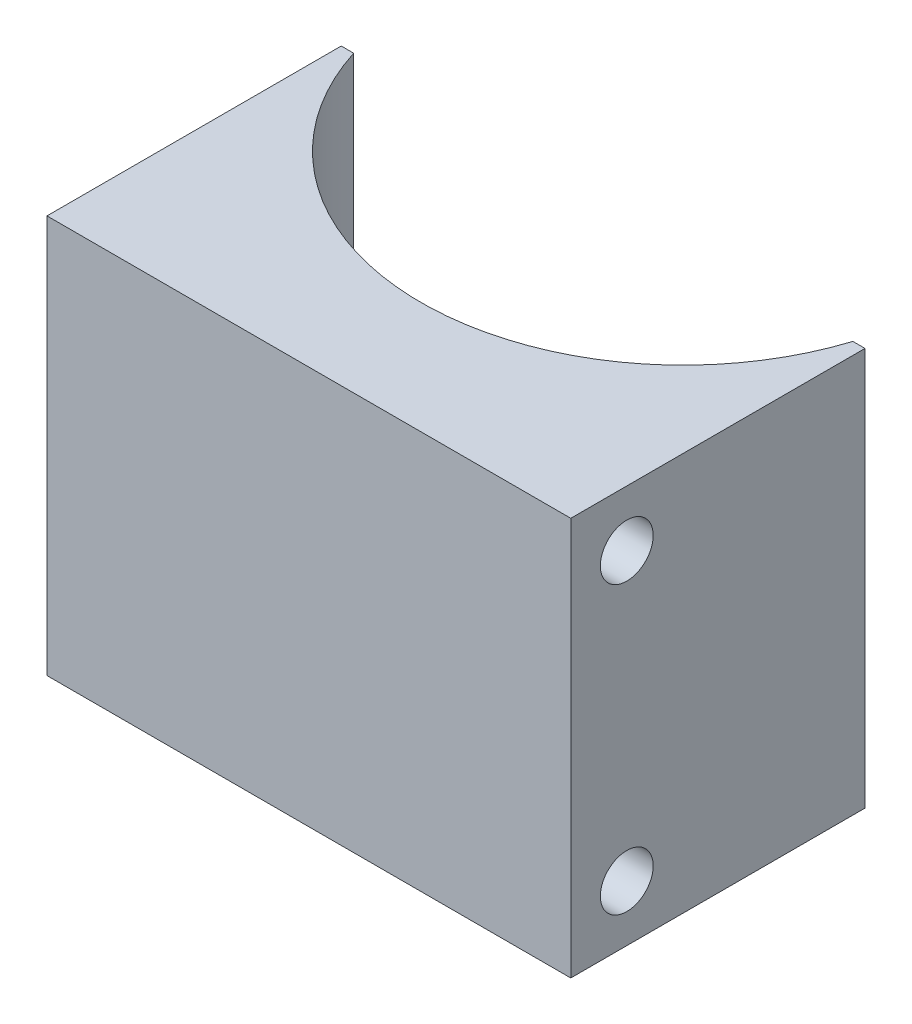
ISO-10303-21;
HEADER;
FILE_DESCRIPTION(('STEP AP214'),'2;1');
FILE_NAME('part.step','',(''),(''),'','','');
FILE_SCHEMA(('AUTOMOTIVE_DESIGN { 1 0 10303 214 1 1 1 1 }'));
ENDSEC;
DATA;
#1=APPLICATION_CONTEXT('core data for automotive mechanical design processes');
#2=APPLICATION_PROTOCOL_DEFINITION('international standard','automotive_design',2000,#1);
#3=PRODUCT_CONTEXT('',#1,'mechanical');
#4=PRODUCT('Part','Part','',(#3));
#5=PRODUCT_RELATED_PRODUCT_CATEGORY('part','',(#4));
#6=PRODUCT_DEFINITION_FORMATION('','',#4);
#7=PRODUCT_DEFINITION_CONTEXT('part definition',#1,'design');
#8=PRODUCT_DEFINITION('design','',#6,#7);
#9=PRODUCT_DEFINITION_SHAPE('','',#8);
#10=(LENGTH_UNIT() NAMED_UNIT(*) SI_UNIT(.MILLI.,.METRE.));
#11=(NAMED_UNIT(*) PLANE_ANGLE_UNIT() SI_UNIT($,.RADIAN.));
#12=(NAMED_UNIT(*) SI_UNIT($,.STERADIAN.) SOLID_ANGLE_UNIT());
#13=UNCERTAINTY_MEASURE_WITH_UNIT(LENGTH_MEASURE(1.E-05),#10,'distance_accuracy_value','');
#14=(GEOMETRIC_REPRESENTATION_CONTEXT(3) GLOBAL_UNCERTAINTY_ASSIGNED_CONTEXT((#13)) GLOBAL_UNIT_ASSIGNED_CONTEXT((#10,
#11,#12)) REPRESENTATION_CONTEXT('',''));
#15=CARTESIAN_POINT('',(0.,0.,0.));
#16=DIRECTION('',(0.,0.,1.));
#17=DIRECTION('',(1.,0.,0.));
#18=AXIS2_PLACEMENT_3D('',#15,#16,#17);
#19=CARTESIAN_POINT('',(44.075,16.,0.));
#20=DIRECTION('',(1.,0.,0.));
#21=DIRECTION('',(0.,0.,-1.));
#22=AXIS2_PLACEMENT_3D('',#19,#20,#21);
#23=PLANE('',#22);
#24=DIRECTION('',(0.,-1.,0.));
#25=VECTOR('',#24,1.);
#26=CARTESIAN_POINT('',(44.075,16.,6.41287766919032));
#27=LINE('',#26,#25);
#28=CARTESIAN_POINT('',(44.075,16.,6.41287766919032));
#29=VERTEX_POINT('',#28);
#30=CARTESIAN_POINT('',(44.075,-16.,6.41287766919032));
#31=VERTEX_POINT('',#30);
#32=EDGE_CURVE('E54',#29,#31,#27,.T.);
#33=ORIENTED_EDGE('',*,*,#32,.T.);
#34=DIRECTION('',(0.,0.,1.));
#35=VECTOR('',#34,1.);
#36=CARTESIAN_POINT('',(44.075,-16.,0.));
#37=LINE('',#36,#35);
#38=CARTESIAN_POINT('',(44.075,-16.,30.0625));
#39=VERTEX_POINT('',#38);
#40=EDGE_CURVE('E117',#31,#39,#37,.T.);
#41=ORIENTED_EDGE('',*,*,#40,.T.);
#42=DIRECTION('',(0.,-1.,0.));
#43=VECTOR('',#42,1.);
#44=CARTESIAN_POINT('',(44.075,16.,30.0625));
#45=LINE('',#44,#43);
#46=CARTESIAN_POINT('',(44.075,16.,30.0625));
#47=VERTEX_POINT('',#46);
#48=EDGE_CURVE('E150',#47,#39,#45,.T.);
#49=ORIENTED_EDGE('',*,*,#48,.F.);
#50=DIRECTION('',(0.,0.,1.));
#51=VECTOR('',#50,1.);
#52=CARTESIAN_POINT('',(44.075,16.,0.));
#53=LINE('',#52,#51);
#54=EDGE_CURVE('E138',#29,#47,#53,.T.);
#55=ORIENTED_EDGE('',*,*,#54,.F.);
#56=EDGE_LOOP('',(#33,#41,#49,#55));
#57=FACE_BOUND('',#56,.T.);
#58=CARTESIAN_POINT('',(44.075,-11.5,25.5625));
#59=DIRECTION('',(-1.,0.,0.));
#60=DIRECTION('',(0.,0.,1.));
#61=AXIS2_PLACEMENT_3D('',#58,#59,#60);
#62=CIRCLE('',#61,2.125);
#63=CARTESIAN_POINT('',(44.075,-11.5,27.6875));
#64=VERTEX_POINT('',#63);
#65=EDGE_CURVE('E123',#64,#64,#62,.F.);
#66=ORIENTED_EDGE('',*,*,#65,.T.);
#67=EDGE_LOOP('',(#66));
#68=FACE_BOUND('',#67,.T.);
#69=CARTESIAN_POINT('',(44.075,11.5,25.5625));
#70=DIRECTION('',(-1.,0.,0.));
#71=DIRECTION('',(0.,0.,1.));
#72=AXIS2_PLACEMENT_3D('',#69,#70,#71);
#73=CIRCLE('',#72,2.125);
#74=CARTESIAN_POINT('',(44.075,11.5,27.6875));
#75=VERTEX_POINT('',#74);
#76=EDGE_CURVE('E153',#75,#75,#73,.T.);
#77=ORIENTED_EDGE('',*,*,#76,.F.);
#78=EDGE_LOOP('',(#77));
#79=FACE_BOUND('',#78,.T.);
#80=ADVANCED_FACE('F45',(#57,#68,#79),#23,.F.);
#81=CARTESIAN_POINT('',(86.175,16.,0.));
#82=DIRECTION('',(1.,0.,0.));
#83=DIRECTION('',(0.,0.,-1.));
#84=AXIS2_PLACEMENT_3D('',#81,#82,#83);
#85=PLANE('',#84);
#86=CARTESIAN_POINT('',(86.175,-11.5,25.5625));
#87=DIRECTION('',(1.,0.,0.));
#88=DIRECTION('',(0.,0.,-1.));
#89=AXIS2_PLACEMENT_3D('',#86,#87,#88);
#90=CIRCLE('',#89,2.125);
#91=CARTESIAN_POINT('',(86.175,-11.5,23.4375));
#92=VERTEX_POINT('',#91);
#93=EDGE_CURVE('E121',#92,#92,#90,.F.);
#94=ORIENTED_EDGE('',*,*,#93,.T.);
#95=EDGE_LOOP('',(#94));
#96=FACE_BOUND('',#95,.T.);
#97=DIRECTION('',(0.,-1.,0.));
#98=VECTOR('',#97,1.);
#99=CARTESIAN_POINT('',(86.175,16.,30.0625));
#100=LINE('',#99,#98);
#101=CARTESIAN_POINT('',(86.175,16.,30.0625));
#102=VERTEX_POINT('',#101);
#103=CARTESIAN_POINT('',(86.175,-16.,30.0625));
#104=VERTEX_POINT('',#103);
#105=EDGE_CURVE('E148',#102,#104,#100,.T.);
#106=ORIENTED_EDGE('',*,*,#105,.T.);
#107=DIRECTION('',(0.,0.,1.));
#108=VECTOR('',#107,1.);
#109=CARTESIAN_POINT('',(86.175,-16.,0.));
#110=LINE('',#109,#108);
#111=CARTESIAN_POINT('',(86.175,-16.,6.41287766919032));
#112=VERTEX_POINT('',#111);
#113=EDGE_CURVE('E130',#112,#104,#110,.T.);
#114=ORIENTED_EDGE('',*,*,#113,.F.);
#115=DIRECTION('',(0.,-1.,0.));
#116=VECTOR('',#115,1.);
#117=CARTESIAN_POINT('',(86.175,16.,6.41287766919032));
#118=LINE('',#117,#116);
#119=CARTESIAN_POINT('',(86.175,16.,6.41287766919032));
#120=VERTEX_POINT('',#119);
#121=EDGE_CURVE('E70',#120,#112,#118,.T.);
#122=ORIENTED_EDGE('',*,*,#121,.F.);
#123=DIRECTION('',(0.,0.,1.));
#124=VECTOR('',#123,1.);
#125=CARTESIAN_POINT('',(86.175,16.,0.));
#126=LINE('',#125,#124);
#127=EDGE_CURVE('E142',#120,#102,#126,.T.);
#128=ORIENTED_EDGE('',*,*,#127,.T.);
#129=EDGE_LOOP('',(#106,#114,#122,#128));
#130=FACE_BOUND('',#129,.T.);
#131=CARTESIAN_POINT('',(86.175,11.5,25.5625));
#132=DIRECTION('',(1.,0.,0.));
#133=DIRECTION('',(0.,0.,-1.));
#134=AXIS2_PLACEMENT_3D('',#131,#132,#133);
#135=CIRCLE('',#134,2.125);
#136=CARTESIAN_POINT('',(86.175,11.5,23.4375));
#137=VERTEX_POINT('',#136);
#138=EDGE_CURVE('E49',#137,#137,#135,.T.);
#139=ORIENTED_EDGE('',*,*,#138,.F.);
#140=EDGE_LOOP('',(#139));
#141=FACE_BOUND('',#140,.T.);
#142=ADVANCED_FACE('F179',(#96,#130,#141),#85,.T.);
#143=CARTESIAN_POINT('',(65.1375,16.,0.));
#144=DIRECTION('',(0.,-1.,0.));
#145=DIRECTION('',(0.,0.,-1.));
#146=AXIS2_PLACEMENT_3D('',#143,#144,#145);
#147=CYLINDRICAL_SURFACE('',#146,21.0625);
#148=DIRECTION('',(0.,-1.,0.));
#149=VECTOR('',#148,1.);
#150=CARTESIAN_POINT('',(85.2,16.,6.41287766919032));
#151=LINE('',#150,#149);
#152=CARTESIAN_POINT('',(85.2,16.,6.41287766919032));
#153=VERTEX_POINT('',#152);
#154=CARTESIAN_POINT('',(85.2,-16.,6.41287766919032));
#155=VERTEX_POINT('',#154);
#156=EDGE_CURVE('E62',#153,#155,#151,.T.);
#157=ORIENTED_EDGE('',*,*,#156,.T.);
#158=CARTESIAN_POINT('',(65.1375,-16.,0.));
#159=DIRECTION('',(0.,1.,0.));
#160=DIRECTION('',(0.,0.,1.));
#161=AXIS2_PLACEMENT_3D('',#158,#159,#160);
#162=CIRCLE('',#161,21.0625);
#163=CARTESIAN_POINT('',(45.075,-16.,6.41287766919032));
#164=VERTEX_POINT('',#163);
#165=EDGE_CURVE('E114',#164,#155,#162,.T.);
#166=ORIENTED_EDGE('',*,*,#165,.F.);
#167=DIRECTION('',(0.,-1.,0.));
#168=VECTOR('',#167,1.);
#169=CARTESIAN_POINT('',(45.075,16.,6.41287766919032));
#170=LINE('',#169,#168);
#171=CARTESIAN_POINT('',(45.075,16.,6.41287766919032));
#172=VERTEX_POINT('',#171);
#173=EDGE_CURVE('E11',#172,#164,#170,.T.);
#174=ORIENTED_EDGE('',*,*,#173,.F.);
#175=CARTESIAN_POINT('',(65.1375,16.,0.));
#176=DIRECTION('',(0.,1.,0.));
#177=DIRECTION('',(0.,0.,1.));
#178=AXIS2_PLACEMENT_3D('',#175,#176,#177);
#179=CIRCLE('',#178,21.0625);
#180=EDGE_CURVE('E135',#172,#153,#179,.T.);
#181=ORIENTED_EDGE('',*,*,#180,.T.);
#182=EDGE_LOOP('',(#157,#166,#174,#181));
#183=FACE_BOUND('',#182,.T.);
#184=ADVANCED_FACE('F47',(#183),#147,.F.);
#185=CARTESIAN_POINT('',(0.,16.,6.41287766919032));
#186=DIRECTION('',(0.,0.,-1.));
#187=DIRECTION('',(-1.,0.,0.));
#188=AXIS2_PLACEMENT_3D('',#185,#186,#187);
#189=PLANE('',#188);
#190=ORIENTED_EDGE('',*,*,#173,.T.);
#191=DIRECTION('',(1.,0.,0.));
#192=VECTOR('',#191,1.);
#193=CARTESIAN_POINT('',(0.,-16.,6.41287766919032));
#194=LINE('',#193,#192);
#195=EDGE_CURVE('E103',#31,#164,#194,.T.);
#196=ORIENTED_EDGE('',*,*,#195,.F.);
#197=ORIENTED_EDGE('',*,*,#32,.F.);
#198=DIRECTION('',(1.,0.,0.));
#199=VECTOR('',#198,1.);
#200=CARTESIAN_POINT('',(0.,16.,6.41287766919032));
#201=LINE('',#200,#199);
#202=EDGE_CURVE('E106',#29,#172,#201,.T.);
#203=ORIENTED_EDGE('',*,*,#202,.T.);
#204=EDGE_LOOP('',(#190,#196,#197,#203));
#205=FACE_BOUND('',#204,.T.);
#206=ADVANCED_FACE('F102',(#205),#189,.T.);
#207=CARTESIAN_POINT('',(0.,16.,30.0625));
#208=DIRECTION('',(0.,0.,-1.));
#209=DIRECTION('',(-1.,0.,0.));
#210=AXIS2_PLACEMENT_3D('',#207,#208,#209);
#211=PLANE('',#210);
#212=ORIENTED_EDGE('',*,*,#48,.T.);
#213=DIRECTION('',(1.,0.,0.));
#214=VECTOR('',#213,1.);
#215=CARTESIAN_POINT('',(0.,-16.,30.0625));
#216=LINE('',#215,#214);
#217=EDGE_CURVE('E127',#39,#104,#216,.T.);
#218=ORIENTED_EDGE('',*,*,#217,.T.);
#219=ORIENTED_EDGE('',*,*,#105,.F.);
#220=DIRECTION('',(1.,0.,0.));
#221=VECTOR('',#220,1.);
#222=CARTESIAN_POINT('',(0.,16.,30.0625));
#223=LINE('',#222,#221);
#224=EDGE_CURVE('E140',#47,#102,#223,.T.);
#225=ORIENTED_EDGE('',*,*,#224,.F.);
#226=EDGE_LOOP('',(#212,#218,#219,#225));
#227=FACE_BOUND('',#226,.T.);
#228=ADVANCED_FACE('F186',(#227),#211,.F.);
#229=CARTESIAN_POINT('',(0.,16.,6.41287766919032));
#230=DIRECTION('',(0.,0.,-1.));
#231=DIRECTION('',(-1.,0.,0.));
#232=AXIS2_PLACEMENT_3D('',#229,#230,#231);
#233=PLANE('',#232);
#234=ORIENTED_EDGE('',*,*,#121,.T.);
#235=DIRECTION('',(1.,0.,0.));
#236=VECTOR('',#235,1.);
#237=CARTESIAN_POINT('',(0.,-16.,6.41287766919032));
#238=LINE('',#237,#236);
#239=EDGE_CURVE('E133',#155,#112,#238,.T.);
#240=ORIENTED_EDGE('',*,*,#239,.F.);
#241=ORIENTED_EDGE('',*,*,#156,.F.);
#242=DIRECTION('',(1.,0.,0.));
#243=VECTOR('',#242,1.);
#244=CARTESIAN_POINT('',(0.,16.,6.41287766919032));
#245=LINE('',#244,#243);
#246=EDGE_CURVE('E144',#153,#120,#245,.T.);
#247=ORIENTED_EDGE('',*,*,#246,.T.);
#248=EDGE_LOOP('',(#234,#240,#241,#247));
#249=FACE_BOUND('',#248,.T.);
#250=ADVANCED_FACE('F192',(#249),#233,.T.);
#251=CARTESIAN_POINT('',(0.,16.,0.));
#252=DIRECTION('',(0.,1.,0.));
#253=DIRECTION('',(0.,0.,1.));
#254=AXIS2_PLACEMENT_3D('',#251,#252,#253);
#255=PLANE('',#254);
#256=ORIENTED_EDGE('',*,*,#180,.F.);
#257=ORIENTED_EDGE('',*,*,#202,.F.);
#258=ORIENTED_EDGE('',*,*,#54,.T.);
#259=ORIENTED_EDGE('',*,*,#224,.T.);
#260=ORIENTED_EDGE('',*,*,#127,.F.);
#261=ORIENTED_EDGE('',*,*,#246,.F.);
#262=EDGE_LOOP('',(#256,#257,#258,#259,#260,#261));
#263=FACE_BOUND('',#262,.T.);
#264=ADVANCED_FACE('F176',(#263),#255,.T.);
#265=CARTESIAN_POINT('',(0.,-16.,0.));
#266=DIRECTION('',(0.,1.,0.));
#267=DIRECTION('',(0.,0.,1.));
#268=AXIS2_PLACEMENT_3D('',#265,#266,#267);
#269=PLANE('',#268);
#270=ORIENTED_EDGE('',*,*,#165,.T.);
#271=ORIENTED_EDGE('',*,*,#239,.T.);
#272=ORIENTED_EDGE('',*,*,#113,.T.);
#273=ORIENTED_EDGE('',*,*,#217,.F.);
#274=ORIENTED_EDGE('',*,*,#40,.F.);
#275=ORIENTED_EDGE('',*,*,#195,.T.);
#276=EDGE_LOOP('',(#270,#271,#272,#273,#274,#275));
#277=FACE_BOUND('',#276,.T.);
#278=ADVANCED_FACE('F112',(#277),#269,.F.);
#279=CARTESIAN_POINT('',(114.075,-11.5,25.5625));
#280=DIRECTION('',(-1.,0.,0.));
#281=DIRECTION('',(0.,0.,1.));
#282=AXIS2_PLACEMENT_3D('',#279,#280,#281);
#283=CYLINDRICAL_SURFACE('',#282,2.125);
#284=ORIENTED_EDGE('',*,*,#93,.F.);
#285=EDGE_LOOP('',(#284));
#286=FACE_BOUND('',#285,.T.);
#287=ORIENTED_EDGE('',*,*,#65,.F.);
#288=EDGE_LOOP('',(#287));
#289=FACE_BOUND('',#288,.T.);
#290=ADVANCED_FACE('F164',(#286,#289),#283,.F.);
#291=CARTESIAN_POINT('',(114.075,11.5,25.5625));
#292=DIRECTION('',(-1.,0.,0.));
#293=DIRECTION('',(0.,0.,1.));
#294=AXIS2_PLACEMENT_3D('',#291,#292,#293);
#295=CYLINDRICAL_SURFACE('',#294,2.125);
#296=ORIENTED_EDGE('',*,*,#138,.T.);
#297=EDGE_LOOP('',(#296));
#298=FACE_BOUND('',#297,.T.);
#299=ORIENTED_EDGE('',*,*,#76,.T.);
#300=EDGE_LOOP('',(#299));
#301=FACE_BOUND('',#300,.T.);
#302=ADVANCED_FACE('F166',(#298,#301),#295,.F.);
#303=CLOSED_SHELL('',(#80,#142,#184,#206,#228,#250,#264,#278,#290,#302));
#304=MANIFOLD_SOLID_BREP('B2',#303);
#305=ADVANCED_BREP_SHAPE_REPRESENTATION('',(#18,#304),#14);
#306=SHAPE_DEFINITION_REPRESENTATION(#9,#305);
ENDSEC;
END-ISO-10303-21;
